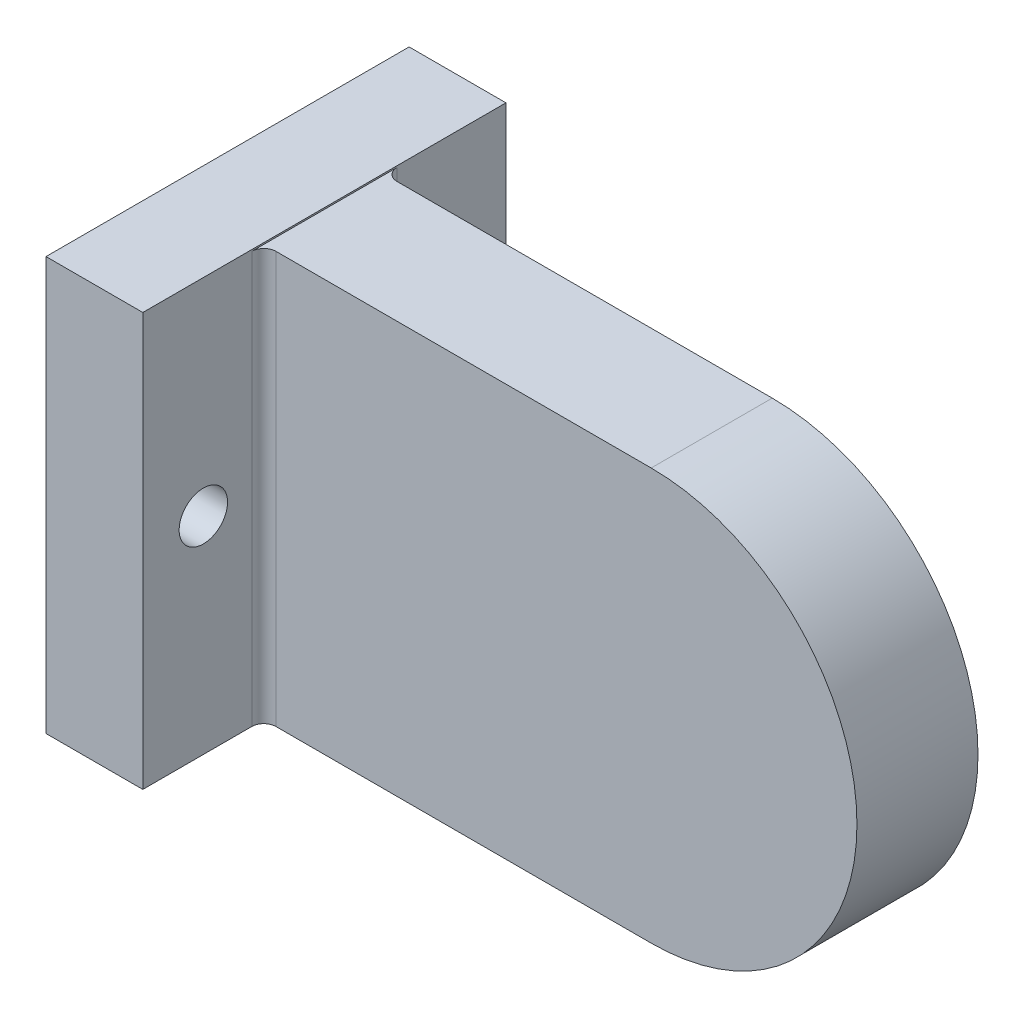
ISO-10303-21;
HEADER;
FILE_DESCRIPTION(('STEP AP214'),'2;1');
FILE_NAME('part.step','',(''),(''),'','','');
FILE_SCHEMA(('AUTOMOTIVE_DESIGN { 1 0 10303 214 1 1 1 1 }'));
ENDSEC;
DATA;
#1=APPLICATION_CONTEXT('core data for automotive mechanical design processes');
#2=APPLICATION_PROTOCOL_DEFINITION('international standard','automotive_design',2000,#1);
#3=PRODUCT_CONTEXT('',#1,'mechanical');
#4=PRODUCT('Part','Part','',(#3));
#5=PRODUCT_RELATED_PRODUCT_CATEGORY('part','',(#4));
#6=PRODUCT_DEFINITION_FORMATION('','',#4);
#7=PRODUCT_DEFINITION_CONTEXT('part definition',#1,'design');
#8=PRODUCT_DEFINITION('design','',#6,#7);
#9=PRODUCT_DEFINITION_SHAPE('','',#8);
#10=(LENGTH_UNIT() NAMED_UNIT(*) SI_UNIT(.MILLI.,.METRE.));
#11=(NAMED_UNIT(*) PLANE_ANGLE_UNIT() SI_UNIT($,.RADIAN.));
#12=(NAMED_UNIT(*) SI_UNIT($,.STERADIAN.) SOLID_ANGLE_UNIT());
#13=UNCERTAINTY_MEASURE_WITH_UNIT(LENGTH_MEASURE(1.E-05),#10,'distance_accuracy_value','');
#14=(GEOMETRIC_REPRESENTATION_CONTEXT(3) GLOBAL_UNCERTAINTY_ASSIGNED_CONTEXT((#13)) GLOBAL_UNIT_ASSIGNED_CONTEXT((#10,
#11,#12)) REPRESENTATION_CONTEXT('',''));
#15=CARTESIAN_POINT('',(0.,0.,0.));
#16=DIRECTION('',(0.,0.,1.));
#17=DIRECTION('',(1.,0.,0.));
#18=AXIS2_PLACEMENT_3D('',#15,#16,#17);
#19=CARTESIAN_POINT('',(22.9128784747792,16.1122835229956,10.));
#20=DIRECTION('',(0.,-1.,0.));
#21=DIRECTION('',(0.,0.,-1.));
#22=AXIS2_PLACEMENT_3D('',#19,#20,#21);
#23=PLANE('',#22);
#24=DIRECTION('',(0.,0.,-1.));
#25=VECTOR('',#24,1.);
#26=CARTESIAN_POINT('',(-9.0871215252208,16.1122835229956,10.));
#27=LINE('',#26,#25);
#28=CARTESIAN_POINT('',(-9.0871215252208,16.1122835229956,11.));
#29=VERTEX_POINT('',#28);
#30=CARTESIAN_POINT('',(-9.0871215252208,16.1122835229956,-0.999999999999999));
#31=VERTEX_POINT('',#30);
#32=EDGE_CURVE('E154',#29,#31,#27,.T.);
#33=ORIENTED_EDGE('',*,*,#32,.F.);
#34=CARTESIAN_POINT('',(-8.0871215252208,16.1122835229956,11.));
#35=DIRECTION('',(0.,-1.,0.));
#36=DIRECTION('',(0.,0.,-1.));
#37=AXIS2_PLACEMENT_3D('',#34,#35,#36);
#38=CIRCLE('',#37,1.);
#39=CARTESIAN_POINT('',(-8.0871215252208,16.1122835229956,10.));
#40=VERTEX_POINT('',#39);
#41=EDGE_CURVE('E11',#29,#40,#38,.T.);
#42=ORIENTED_EDGE('',*,*,#41,.T.);
#43=DIRECTION('',(-1.,0.,0.));
#44=VECTOR('',#43,1.);
#45=CARTESIAN_POINT('',(22.9128784747792,16.1122835229956,10.));
#46=LINE('',#45,#44);
#47=CARTESIAN_POINT('',(22.9128784747792,16.1122835229956,10.));
#48=VERTEX_POINT('',#47);
#49=EDGE_CURVE('E163',#48,#40,#46,.T.);
#50=ORIENTED_EDGE('',*,*,#49,.F.);
#51=DIRECTION('',(0.,0.,-1.));
#52=VECTOR('',#51,1.);
#53=CARTESIAN_POINT('',(22.9128784747792,16.1122835229956,10.));
#54=LINE('',#53,#52);
#55=CARTESIAN_POINT('',(22.9128784747792,16.1122835229956,0.));
#56=VERTEX_POINT('',#55);
#57=EDGE_CURVE('E178',#48,#56,#54,.T.);
#58=ORIENTED_EDGE('',*,*,#57,.T.);
#59=DIRECTION('',(-1.,0.,0.));
#60=VECTOR('',#59,1.);
#61=CARTESIAN_POINT('',(22.9128784747792,16.1122835229956,0.));
#62=LINE('',#61,#60);
#63=CARTESIAN_POINT('',(-8.0871215252208,16.1122835229956,0.));
#64=VERTEX_POINT('',#63);
#65=EDGE_CURVE('E171',#56,#64,#62,.T.);
#66=ORIENTED_EDGE('',*,*,#65,.T.);
#67=CARTESIAN_POINT('',(-8.0871215252208,16.1122835229956,-1.));
#68=DIRECTION('',(0.,-1.,0.));
#69=DIRECTION('',(0.,0.,-1.));
#70=AXIS2_PLACEMENT_3D('',#67,#68,#69);
#71=CIRCLE('',#70,1.);
#72=EDGE_CURVE('E191',#64,#31,#71,.T.);
#73=ORIENTED_EDGE('',*,*,#72,.T.);
#74=EDGE_LOOP('',(#33,#42,#50,#58,#66,#73));
#75=FACE_BOUND('',#74,.T.);
#76=ADVANCED_FACE('F33',(#75),#23,.F.);
#77=CARTESIAN_POINT('',(22.9128784747792,-0.887716477004379,10.));
#78=DIRECTION('',(0.,0.,1.));
#79=DIRECTION('',(1.,0.,0.));
#80=AXIS2_PLACEMENT_3D('',#77,#78,#79);
#81=PLANE('',#80);
#82=ORIENTED_EDGE('',*,*,#49,.T.);
#83=DIRECTION('',(0.,-1.,0.));
#84=VECTOR('',#83,1.);
#85=CARTESIAN_POINT('',(-8.0871215252208,-0.887716477004385,10.));
#86=LINE('',#85,#84);
#87=CARTESIAN_POINT('',(-8.0871215252208,-17.8877164770044,10.));
#88=VERTEX_POINT('',#87);
#89=EDGE_CURVE('E187',#40,#88,#86,.T.);
#90=ORIENTED_EDGE('',*,*,#89,.T.);
#91=DIRECTION('',(1.,0.,0.));
#92=VECTOR('',#91,1.);
#93=CARTESIAN_POINT('',(22.9128784747792,-17.8877164770044,10.));
#94=LINE('',#93,#92);
#95=CARTESIAN_POINT('',(22.9128784747792,-17.8877164770044,10.));
#96=VERTEX_POINT('',#95);
#97=EDGE_CURVE('E166',#88,#96,#94,.T.);
#98=ORIENTED_EDGE('',*,*,#97,.T.);
#99=CARTESIAN_POINT('',(22.9128784747792,-0.887716477004379,10.));
#100=DIRECTION('',(0.,0.,1.));
#101=DIRECTION('',(1.,0.,0.));
#102=AXIS2_PLACEMENT_3D('',#99,#100,#101);
#103=CIRCLE('',#102,17.);
#104=EDGE_CURVE('E160',#96,#48,#103,.T.);
#105=ORIENTED_EDGE('',*,*,#104,.T.);
#106=EDGE_LOOP('',(#82,#90,#98,#105));
#107=FACE_BOUND('',#106,.T.);
#108=ADVANCED_FACE('F225',(#107),#81,.T.);
#109=CARTESIAN_POINT('',(22.9128784747792,-0.887716477004379,0.));
#110=DIRECTION('',(0.,0.,1.));
#111=DIRECTION('',(1.,0.,0.));
#112=AXIS2_PLACEMENT_3D('',#109,#110,#111);
#113=PLANE('',#112);
#114=CARTESIAN_POINT('',(22.9128784747792,-0.887716477004377,0.));
#115=DIRECTION('',(0.,0.,-1.));
#116=DIRECTION('',(-1.,0.,0.));
#117=AXIS2_PLACEMENT_3D('',#114,#115,#116);
#118=CIRCLE('',#117,13.65);
#119=CARTESIAN_POINT('',(9.2628784747792,-0.887716477004377,0.));
#120=VERTEX_POINT('',#119);
#121=EDGE_CURVE('E206',#120,#120,#118,.T.);
#122=ORIENTED_EDGE('',*,*,#121,.F.);
#123=EDGE_LOOP('',(#122));
#124=FACE_BOUND('',#123,.T.);
#125=DIRECTION('',(1.,0.,0.));
#126=VECTOR('',#125,1.);
#127=CARTESIAN_POINT('',(22.9128784747792,-17.8877164770044,0.));
#128=LINE('',#127,#126);
#129=CARTESIAN_POINT('',(-8.0871215252208,-17.8877164770044,0.));
#130=VERTEX_POINT('',#129);
#131=CARTESIAN_POINT('',(22.9128784747792,-17.8877164770044,0.));
#132=VERTEX_POINT('',#131);
#133=EDGE_CURVE('E164',#130,#132,#128,.T.);
#134=ORIENTED_EDGE('',*,*,#133,.F.);
#135=DIRECTION('',(0.,-1.,0.));
#136=VECTOR('',#135,1.);
#137=CARTESIAN_POINT('',(-8.0871215252208,16.1122835229956,0.));
#138=LINE('',#137,#136);
#139=EDGE_CURVE('E185',#130,#64,#138,.F.);
#140=ORIENTED_EDGE('',*,*,#139,.T.);
#141=ORIENTED_EDGE('',*,*,#65,.F.);
#142=CARTESIAN_POINT('',(22.9128784747792,-0.887716477004379,0.));
#143=DIRECTION('',(0.,0.,1.));
#144=DIRECTION('',(1.,0.,0.));
#145=AXIS2_PLACEMENT_3D('',#142,#143,#144);
#146=CIRCLE('',#145,17.);
#147=EDGE_CURVE('E159',#132,#56,#146,.T.);
#148=ORIENTED_EDGE('',*,*,#147,.F.);
#149=EDGE_LOOP('',(#134,#140,#141,#148));
#150=FACE_BOUND('',#149,.T.);
#151=ADVANCED_FACE('F221',(#124,#150),#113,.F.);
#152=CARTESIAN_POINT('',(22.9128784747792,-0.887716477004379,10.));
#153=DIRECTION('',(0.,0.,-1.));
#154=DIRECTION('',(-1.,0.,0.));
#155=AXIS2_PLACEMENT_3D('',#152,#153,#154);
#156=CYLINDRICAL_SURFACE('',#155,17.);
#157=ORIENTED_EDGE('',*,*,#147,.T.);
#158=ORIENTED_EDGE('',*,*,#57,.F.);
#159=ORIENTED_EDGE('',*,*,#104,.F.);
#160=DIRECTION('',(0.,0.,-1.));
#161=VECTOR('',#160,1.);
#162=CARTESIAN_POINT('',(22.9128784747792,-17.8877164770044,10.));
#163=LINE('',#162,#161);
#164=EDGE_CURVE('E168',#96,#132,#163,.T.);
#165=ORIENTED_EDGE('',*,*,#164,.T.);
#166=EDGE_LOOP('',(#157,#158,#159,#165));
#167=FACE_BOUND('',#166,.T.);
#168=ADVANCED_FACE('F224',(#167),#156,.T.);
#169=CARTESIAN_POINT('',(-17.0871215252208,16.1122835229956,10.));
#170=DIRECTION('',(1.,0.,0.));
#171=DIRECTION('',(0.,1.,0.));
#172=AXIS2_PLACEMENT_3D('',#169,#170,#171);
#173=PLANE('',#172);
#174=CARTESIAN_POINT('',(-17.0871215252208,-0.824261248683137,15.));
#175=DIRECTION('',(-1.,0.,0.));
#176=DIRECTION('',(0.,-1.,0.));
#177=AXIS2_PLACEMENT_3D('',#174,#175,#176);
#178=CIRCLE('',#177,2.);
#179=CARTESIAN_POINT('',(-17.0871215252208,-2.82426124868314,15.));
#180=VERTEX_POINT('',#179);
#181=EDGE_CURVE('E196',#180,#180,#178,.T.);
#182=ORIENTED_EDGE('',*,*,#181,.F.);
#183=EDGE_LOOP('',(#182));
#184=FACE_BOUND('',#183,.T.);
#185=CARTESIAN_POINT('',(-17.0871215252208,-0.824261248683137,-5.));
#186=DIRECTION('',(-1.,0.,0.));
#187=DIRECTION('',(0.,-1.,0.));
#188=AXIS2_PLACEMENT_3D('',#185,#186,#187);
#189=CIRCLE('',#188,2.);
#190=CARTESIAN_POINT('',(-17.0871215252208,-2.82426124868314,-5.));
#191=VERTEX_POINT('',#190);
#192=EDGE_CURVE('E143',#191,#191,#189,.T.);
#193=ORIENTED_EDGE('',*,*,#192,.F.);
#194=EDGE_LOOP('',(#193));
#195=FACE_BOUND('',#194,.T.);
#196=DIRECTION('',(0.,0.,-1.));
#197=VECTOR('',#196,1.);
#198=CARTESIAN_POINT('',(-17.0871215252208,-17.8877164770044,10.));
#199=LINE('',#198,#197);
#200=CARTESIAN_POINT('',(-17.0871215252208,-17.8877164770044,20.));
#201=VERTEX_POINT('',#200);
#202=CARTESIAN_POINT('',(-17.0871215252208,-17.8877164770044,-10.));
#203=VERTEX_POINT('',#202);
#204=EDGE_CURVE('E115',#201,#203,#199,.T.);
#205=ORIENTED_EDGE('',*,*,#204,.F.);
#206=DIRECTION('',(0.,1.,0.));
#207=VECTOR('',#206,1.);
#208=CARTESIAN_POINT('',(-17.0871215252208,16.2391939796381,20.));
#209=LINE('',#208,#207);
#210=CARTESIAN_POINT('',(-17.0871215252208,16.2391939796381,20.));
#211=VERTEX_POINT('',#210);
#212=EDGE_CURVE('E140',#201,#211,#209,.T.);
#213=ORIENTED_EDGE('',*,*,#212,.T.);
#214=DIRECTION('',(0.,0.,-1.));
#215=VECTOR('',#214,1.);
#216=CARTESIAN_POINT('',(-17.0871215252208,16.2391939796381,-10.));
#217=LINE('',#216,#215);
#218=CARTESIAN_POINT('',(-17.0871215252208,16.2391939796381,-10.));
#219=VERTEX_POINT('',#218);
#220=EDGE_CURVE('E137',#211,#219,#217,.T.);
#221=ORIENTED_EDGE('',*,*,#220,.T.);
#222=DIRECTION('',(0.,-1.,0.));
#223=VECTOR('',#222,1.);
#224=CARTESIAN_POINT('',(-17.0871215252208,16.2391939796381,-10.));
#225=LINE('',#224,#223);
#226=EDGE_CURVE('E149',#219,#203,#225,.T.);
#227=ORIENTED_EDGE('',*,*,#226,.T.);
#228=EDGE_LOOP('',(#205,#213,#221,#227));
#229=FACE_BOUND('',#228,.T.);
#230=ADVANCED_FACE('F247',(#184,#195,#229),#173,.F.);
#231=CARTESIAN_POINT('',(22.9128784747792,-17.8877164770044,10.));
#232=DIRECTION('',(0.,1.,0.));
#233=DIRECTION('',(-1.,0.,0.));
#234=AXIS2_PLACEMENT_3D('',#231,#232,#233);
#235=PLANE('',#234);
#236=ORIENTED_EDGE('',*,*,#204,.T.);
#237=DIRECTION('',(-1.,0.,0.));
#238=VECTOR('',#237,1.);
#239=CARTESIAN_POINT('',(-9.0871215252208,-17.8877164770044,-10.));
#240=LINE('',#239,#238);
#241=CARTESIAN_POINT('',(-9.0871215252208,-17.8877164770044,-10.));
#242=VERTEX_POINT('',#241);
#243=EDGE_CURVE('E110',#242,#203,#240,.T.);
#244=ORIENTED_EDGE('',*,*,#243,.F.);
#245=DIRECTION('',(0.,0.,1.));
#246=VECTOR('',#245,1.);
#247=CARTESIAN_POINT('',(-9.0871215252208,-17.8877164770044,-10.));
#248=LINE('',#247,#246);
#249=CARTESIAN_POINT('',(-9.0871215252208,-17.8877164770044,-1.));
#250=VERTEX_POINT('',#249);
#251=EDGE_CURVE('E113',#242,#250,#248,.T.);
#252=ORIENTED_EDGE('',*,*,#251,.T.);
#253=CARTESIAN_POINT('',(-8.0871215252208,-17.8877164770044,-1.));
#254=DIRECTION('',(0.,1.,0.));
#255=DIRECTION('',(-1.,0.,0.));
#256=AXIS2_PLACEMENT_3D('',#253,#254,#255);
#257=CIRCLE('',#256,1.);
#258=EDGE_CURVE('E189',#250,#130,#257,.T.);
#259=ORIENTED_EDGE('',*,*,#258,.T.);
#260=ORIENTED_EDGE('',*,*,#133,.T.);
#261=ORIENTED_EDGE('',*,*,#164,.F.);
#262=ORIENTED_EDGE('',*,*,#97,.F.);
#263=CARTESIAN_POINT('',(-8.0871215252208,-17.8877164770044,11.));
#264=DIRECTION('',(0.,1.,0.));
#265=DIRECTION('',(-1.,0.,0.));
#266=AXIS2_PLACEMENT_3D('',#263,#264,#265);
#267=CIRCLE('',#266,1.);
#268=CARTESIAN_POINT('',(-9.0871215252208,-17.8877164770044,11.));
#269=VERTEX_POINT('',#268);
#270=EDGE_CURVE('E42',#88,#269,#267,.T.);
#271=ORIENTED_EDGE('',*,*,#270,.T.);
#272=CARTESIAN_POINT('',(-9.0871215252208,-17.8877164770044,20.));
#273=VERTEX_POINT('',#272);
#274=EDGE_CURVE('E133',#269,#273,#248,.T.);
#275=ORIENTED_EDGE('',*,*,#274,.T.);
#276=DIRECTION('',(-1.,0.,0.));
#277=VECTOR('',#276,1.);
#278=CARTESIAN_POINT('',(-9.0871215252208,-17.8877164770044,20.));
#279=LINE('',#278,#277);
#280=EDGE_CURVE('E120',#273,#201,#279,.T.);
#281=ORIENTED_EDGE('',*,*,#280,.T.);
#282=EDGE_LOOP('',(#236,#244,#252,#259,#260,#261,#262,#271,#275,#281));
#283=FACE_BOUND('',#282,.T.);
#284=ADVANCED_FACE('F112',(#283),#235,.F.);
#285=CARTESIAN_POINT('',(-9.08712152522081,16.2391939796381,-10.));
#286=DIRECTION('',(0.,0.,-1.));
#287=DIRECTION('',(0.,1.,0.));
#288=AXIS2_PLACEMENT_3D('',#285,#286,#287);
#289=PLANE('',#288);
#290=ORIENTED_EDGE('',*,*,#226,.F.);
#291=DIRECTION('',(-1.,0.,0.));
#292=VECTOR('',#291,1.);
#293=CARTESIAN_POINT('',(-9.08712152522081,16.2391939796381,-10.));
#294=LINE('',#293,#292);
#295=CARTESIAN_POINT('',(-9.08712152522081,16.2391939796381,-10.));
#296=VERTEX_POINT('',#295);
#297=EDGE_CURVE('E136',#296,#219,#294,.T.);
#298=ORIENTED_EDGE('',*,*,#297,.F.);
#299=DIRECTION('',(0.,-1.,0.));
#300=VECTOR('',#299,1.);
#301=CARTESIAN_POINT('',(-9.08712152522081,16.2391939796381,-10.));
#302=LINE('',#301,#300);
#303=EDGE_CURVE('E128',#296,#242,#302,.T.);
#304=ORIENTED_EDGE('',*,*,#303,.T.);
#305=ORIENTED_EDGE('',*,*,#243,.T.);
#306=EDGE_LOOP('',(#290,#298,#304,#305));
#307=FACE_BOUND('',#306,.T.);
#308=ADVANCED_FACE('F135',(#307),#289,.T.);
#309=CARTESIAN_POINT('',(-9.08712152522081,16.2391939796381,-10.));
#310=DIRECTION('',(0.,1.,0.));
#311=DIRECTION('',(0.,0.,1.));
#312=AXIS2_PLACEMENT_3D('',#309,#310,#311);
#313=PLANE('',#312);
#314=ORIENTED_EDGE('',*,*,#220,.F.);
#315=DIRECTION('',(-1.,0.,0.));
#316=VECTOR('',#315,1.);
#317=CARTESIAN_POINT('',(-9.08712152522081,16.2391939796381,20.));
#318=LINE('',#317,#316);
#319=CARTESIAN_POINT('',(-9.08712152522081,16.2391939796381,20.));
#320=VERTEX_POINT('',#319);
#321=EDGE_CURVE('E155',#320,#211,#318,.T.);
#322=ORIENTED_EDGE('',*,*,#321,.F.);
#323=DIRECTION('',(0.,0.,-1.));
#324=VECTOR('',#323,1.);
#325=CARTESIAN_POINT('',(-9.08712152522081,16.2391939796381,-10.));
#326=LINE('',#325,#324);
#327=EDGE_CURVE('E121',#320,#296,#326,.T.);
#328=ORIENTED_EDGE('',*,*,#327,.T.);
#329=ORIENTED_EDGE('',*,*,#297,.T.);
#330=EDGE_LOOP('',(#314,#322,#328,#329));
#331=FACE_BOUND('',#330,.T.);
#332=ADVANCED_FACE('F249',(#331),#313,.T.);
#333=CARTESIAN_POINT('',(-9.08712152522081,16.2391939796381,20.));
#334=DIRECTION('',(0.,0.,1.));
#335=DIRECTION('',(0.,-1.,0.));
#336=AXIS2_PLACEMENT_3D('',#333,#334,#335);
#337=PLANE('',#336);
#338=ORIENTED_EDGE('',*,*,#212,.F.);
#339=ORIENTED_EDGE('',*,*,#280,.F.);
#340=DIRECTION('',(0.,1.,0.));
#341=VECTOR('',#340,1.);
#342=CARTESIAN_POINT('',(-9.08712152522081,16.2391939796381,20.));
#343=LINE('',#342,#341);
#344=EDGE_CURVE('E132',#273,#320,#343,.T.);
#345=ORIENTED_EDGE('',*,*,#344,.T.);
#346=ORIENTED_EDGE('',*,*,#321,.T.);
#347=EDGE_LOOP('',(#338,#339,#345,#346));
#348=FACE_BOUND('',#347,.T.);
#349=ADVANCED_FACE('F244',(#348),#337,.T.);
#350=CARTESIAN_POINT('',(-9.0871215252208,0.,0.));
#351=DIRECTION('',(-1.,0.,0.));
#352=DIRECTION('',(0.,-1.,0.));
#353=AXIS2_PLACEMENT_3D('',#350,#351,#352);
#354=PLANE('',#353);
#355=CARTESIAN_POINT('',(-9.0871215252208,-0.824261248683134,15.));
#356=DIRECTION('',(-1.,0.,0.));
#357=DIRECTION('',(0.,-1.,0.));
#358=AXIS2_PLACEMENT_3D('',#355,#356,#357);
#359=CIRCLE('',#358,2.);
#360=CARTESIAN_POINT('',(-9.0871215252208,-2.82426124868314,15.));
#361=VERTEX_POINT('',#360);
#362=EDGE_CURVE('E37',#361,#361,#359,.T.);
#363=ORIENTED_EDGE('',*,*,#362,.T.);
#364=EDGE_LOOP('',(#363));
#365=FACE_BOUND('',#364,.T.);
#366=CARTESIAN_POINT('',(-9.0871215252208,-0.824261248683134,-5.));
#367=DIRECTION('',(-1.,0.,0.));
#368=DIRECTION('',(0.,-1.,0.));
#369=AXIS2_PLACEMENT_3D('',#366,#367,#368);
#370=CIRCLE('',#369,2.);
#371=CARTESIAN_POINT('',(-9.0871215252208,-2.82426124868313,-5.));
#372=VERTEX_POINT('',#371);
#373=EDGE_CURVE('E194',#372,#372,#370,.T.);
#374=ORIENTED_EDGE('',*,*,#373,.T.);
#375=EDGE_LOOP('',(#374));
#376=FACE_BOUND('',#375,.T.);
#377=ORIENTED_EDGE('',*,*,#32,.T.);
#378=DIRECTION('',(0.,-1.,0.));
#379=VECTOR('',#378,1.);
#380=CARTESIAN_POINT('',(-9.0871215252208,-17.8877164770044,-1.));
#381=LINE('',#380,#379);
#382=EDGE_CURVE('E131',#31,#250,#381,.T.);
#383=ORIENTED_EDGE('',*,*,#382,.T.);
#384=ORIENTED_EDGE('',*,*,#251,.F.);
#385=ORIENTED_EDGE('',*,*,#303,.F.);
#386=ORIENTED_EDGE('',*,*,#327,.F.);
#387=ORIENTED_EDGE('',*,*,#344,.F.);
#388=ORIENTED_EDGE('',*,*,#274,.F.);
#389=DIRECTION('',(0.,-1.,0.));
#390=VECTOR('',#389,1.);
#391=CARTESIAN_POINT('',(-9.0871215252208,0.,11.));
#392=LINE('',#391,#390);
#393=EDGE_CURVE('E181',#269,#29,#392,.F.);
#394=ORIENTED_EDGE('',*,*,#393,.T.);
#395=EDGE_LOOP('',(#377,#383,#384,#385,#386,#387,#388,#394));
#396=FACE_BOUND('',#395,.T.);
#397=ADVANCED_FACE('F126',(#365,#376,#396),#354,.F.);
#398=CARTESIAN_POINT('',(-8.0871215252208,0.,-1.));
#399=DIRECTION('',(0.,1.,0.));
#400=DIRECTION('',(-1.,0.,0.));
#401=AXIS2_PLACEMENT_3D('',#398,#399,#400);
#402=CYLINDRICAL_SURFACE('',#401,1.);
#403=ORIENTED_EDGE('',*,*,#72,.F.);
#404=ORIENTED_EDGE('',*,*,#139,.F.);
#405=ORIENTED_EDGE('',*,*,#258,.F.);
#406=ORIENTED_EDGE('',*,*,#382,.F.);
#407=EDGE_LOOP('',(#403,#404,#405,#406));
#408=FACE_BOUND('',#407,.T.);
#409=ADVANCED_FACE('F233',(#408),#402,.F.);
#410=CARTESIAN_POINT('',(-8.0871215252208,-0.887716477004385,11.));
#411=DIRECTION('',(0.,-1.,0.));
#412=DIRECTION('',(1.,0.,0.));
#413=AXIS2_PLACEMENT_3D('',#410,#411,#412);
#414=CYLINDRICAL_SURFACE('',#413,1.);
#415=ORIENTED_EDGE('',*,*,#41,.F.);
#416=ORIENTED_EDGE('',*,*,#393,.F.);
#417=ORIENTED_EDGE('',*,*,#270,.F.);
#418=ORIENTED_EDGE('',*,*,#89,.F.);
#419=EDGE_LOOP('',(#415,#416,#417,#418));
#420=FACE_BOUND('',#419,.T.);
#421=ADVANCED_FACE('F35',(#420),#414,.F.);
#422=CARTESIAN_POINT('',(39.9128784747792,-0.824261248683119,-5.));
#423=DIRECTION('',(-1.,0.,0.));
#424=DIRECTION('',(0.,-1.,0.));
#425=AXIS2_PLACEMENT_3D('',#422,#423,#424);
#426=CYLINDRICAL_SURFACE('',#425,2.);
#427=ORIENTED_EDGE('',*,*,#192,.T.);
#428=EDGE_LOOP('',(#427));
#429=FACE_BOUND('',#428,.T.);
#430=ORIENTED_EDGE('',*,*,#373,.F.);
#431=EDGE_LOOP('',(#430));
#432=FACE_BOUND('',#431,.T.);
#433=ADVANCED_FACE('F274',(#429,#432),#426,.F.);
#434=CARTESIAN_POINT('',(39.9128784747792,-0.824261248683119,15.));
#435=DIRECTION('',(-1.,0.,0.));
#436=DIRECTION('',(0.,-1.,0.));
#437=AXIS2_PLACEMENT_3D('',#434,#435,#436);
#438=CYLINDRICAL_SURFACE('',#437,2.);
#439=ORIENTED_EDGE('',*,*,#181,.T.);
#440=EDGE_LOOP('',(#439));
#441=FACE_BOUND('',#440,.T.);
#442=ORIENTED_EDGE('',*,*,#362,.F.);
#443=EDGE_LOOP('',(#442));
#444=FACE_BOUND('',#443,.T.);
#445=ADVANCED_FACE('F217',(#441,#444),#438,.F.);
#446=CARTESIAN_POINT('',(22.9128784747792,-0.887716477004377,8.));
#447=DIRECTION('',(0.,0.,-1.));
#448=DIRECTION('',(-1.,0.,0.));
#449=AXIS2_PLACEMENT_3D('',#446,#447,#448);
#450=CYLINDRICAL_SURFACE('',#449,13.65);
#451=CARTESIAN_POINT('',(22.9128784747792,-0.887716477004377,8.));
#452=DIRECTION('',(0.,0.,-1.));
#453=DIRECTION('',(-1.,0.,0.));
#454=AXIS2_PLACEMENT_3D('',#451,#452,#453);
#455=CIRCLE('',#454,13.65);
#456=CARTESIAN_POINT('',(9.2628784747792,-0.887716477004377,8.));
#457=VERTEX_POINT('',#456);
#458=EDGE_CURVE('E204',#457,#457,#455,.T.);
#459=ORIENTED_EDGE('',*,*,#458,.F.);
#460=EDGE_LOOP('',(#459));
#461=FACE_BOUND('',#460,.T.);
#462=ORIENTED_EDGE('',*,*,#121,.T.);
#463=EDGE_LOOP('',(#462));
#464=FACE_BOUND('',#463,.T.);
#465=ADVANCED_FACE('F214',(#461,#464),#450,.F.);
#466=CARTESIAN_POINT('',(22.9128784747792,-0.887716477004377,8.));
#467=DIRECTION('',(0.,0.,-1.));
#468=DIRECTION('',(-1.,0.,0.));
#469=AXIS2_PLACEMENT_3D('',#466,#467,#468);
#470=PLANE('',#469);
#471=ORIENTED_EDGE('',*,*,#458,.T.);
#472=EDGE_LOOP('',(#471));
#473=FACE_BOUND('',#472,.T.);
#474=ADVANCED_FACE('F212',(#473),#470,.T.);
#475=CLOSED_SHELL('',(#76,#108,#151,#168,#230,#284,#308,#332,#349,#397,#409,#421,#433,#445,#465,#474));
#476=MANIFOLD_SOLID_BREP('B2',#475);
#477=ADVANCED_BREP_SHAPE_REPRESENTATION('',(#18,#476),#14);
#478=SHAPE_DEFINITION_REPRESENTATION(#9,#477);
ENDSEC;
END-ISO-10303-21;
